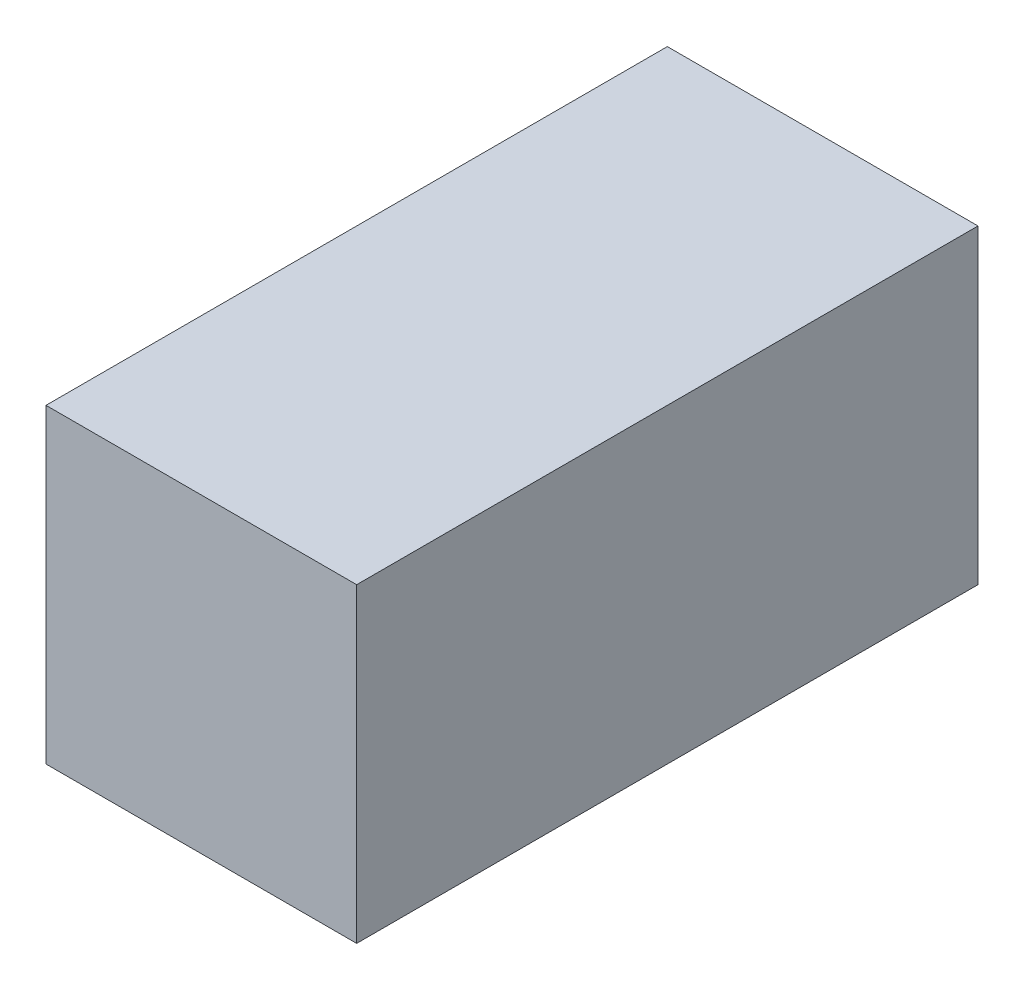
ISO-10303-21;
HEADER;
FILE_DESCRIPTION(('STEP AP214'),'2;1');
FILE_NAME('part.step','',(''),(''),'','','');
FILE_SCHEMA(('AUTOMOTIVE_DESIGN { 1 0 10303 214 1 1 1 1 }'));
ENDSEC;
DATA;
#1=APPLICATION_CONTEXT('core data for automotive mechanical design processes');
#2=APPLICATION_PROTOCOL_DEFINITION('international standard','automotive_design',2000,#1);
#3=PRODUCT_CONTEXT('',#1,'mechanical');
#4=PRODUCT('Part','Part','',(#3));
#5=PRODUCT_RELATED_PRODUCT_CATEGORY('part','',(#4));
#6=PRODUCT_DEFINITION_FORMATION('','',#4);
#7=PRODUCT_DEFINITION_CONTEXT('part definition',#1,'design');
#8=PRODUCT_DEFINITION('design','',#6,#7);
#9=PRODUCT_DEFINITION_SHAPE('','',#8);
#10=(LENGTH_UNIT() NAMED_UNIT(*) SI_UNIT(.MILLI.,.METRE.));
#11=(NAMED_UNIT(*) PLANE_ANGLE_UNIT() SI_UNIT($,.RADIAN.));
#12=(NAMED_UNIT(*) SI_UNIT($,.STERADIAN.) SOLID_ANGLE_UNIT());
#13=UNCERTAINTY_MEASURE_WITH_UNIT(LENGTH_MEASURE(1.E-05),#10,'distance_accuracy_value','');
#14=(GEOMETRIC_REPRESENTATION_CONTEXT(3) GLOBAL_UNCERTAINTY_ASSIGNED_CONTEXT((#13)) GLOBAL_UNIT_ASSIGNED_CONTEXT((#10,
#11,#12)) REPRESENTATION_CONTEXT('',''));
#15=CARTESIAN_POINT('',(0.,0.,0.));
#16=DIRECTION('',(0.,0.,1.));
#17=DIRECTION('',(1.,0.,0.));
#18=AXIS2_PLACEMENT_3D('',#15,#16,#17);
#19=CARTESIAN_POINT('',(5.,10.,-10.));
#20=DIRECTION('',(-1.,0.,0.));
#21=DIRECTION('',(0.,0.,1.));
#22=AXIS2_PLACEMENT_3D('',#19,#20,#21);
#23=PLANE('',#22);
#24=DIRECTION('',(0.,0.,-1.));
#25=VECTOR('',#24,1.);
#26=CARTESIAN_POINT('',(5.,0.,-10.));
#27=LINE('',#26,#25);
#28=CARTESIAN_POINT('',(5.,0.,10.));
#29=VERTEX_POINT('',#28);
#30=CARTESIAN_POINT('',(5.,0.,-10.));
#31=VERTEX_POINT('',#30);
#32=EDGE_CURVE('E113',#29,#31,#27,.T.);
#33=ORIENTED_EDGE('',*,*,#32,.T.);
#34=DIRECTION('',(0.,-1.,0.));
#35=VECTOR('',#34,1.);
#36=CARTESIAN_POINT('',(5.,10.,-10.));
#37=LINE('',#36,#35);
#38=CARTESIAN_POINT('',(5.,10.,-10.));
#39=VERTEX_POINT('',#38);
#40=EDGE_CURVE('E11',#39,#31,#37,.T.);
#41=ORIENTED_EDGE('',*,*,#40,.F.);
#42=DIRECTION('',(0.,0.,-1.));
#43=VECTOR('',#42,1.);
#44=CARTESIAN_POINT('',(5.,10.,-10.));
#45=LINE('',#44,#43);
#46=CARTESIAN_POINT('',(5.,10.,10.));
#47=VERTEX_POINT('',#46);
#48=EDGE_CURVE('E97',#47,#39,#45,.T.);
#49=ORIENTED_EDGE('',*,*,#48,.F.);
#50=DIRECTION('',(0.,-1.,0.));
#51=VECTOR('',#50,1.);
#52=CARTESIAN_POINT('',(5.,10.,10.));
#53=LINE('',#52,#51);
#54=EDGE_CURVE('E109',#47,#29,#53,.T.);
#55=ORIENTED_EDGE('',*,*,#54,.T.);
#56=EDGE_LOOP('',(#33,#41,#49,#55));
#57=FACE_BOUND('',#56,.T.);
#58=ADVANCED_FACE('F45',(#57),#23,.F.);
#59=CARTESIAN_POINT('',(-5.,10.,-10.));
#60=DIRECTION('',(0.,0.,1.));
#61=DIRECTION('',(1.,0.,0.));
#62=AXIS2_PLACEMENT_3D('',#59,#60,#61);
#63=PLANE('',#62);
#64=CARTESIAN_POINT('',(0.,5.,-10.));
#65=DIRECTION('',(0.,0.,-1.));
#66=DIRECTION('',(-1.,0.,0.));
#67=AXIS2_PLACEMENT_3D('',#64,#65,#66);
#68=CIRCLE('',#67,2.5);
#69=CARTESIAN_POINT('',(-2.5,5.,-10.));
#70=VERTEX_POINT('',#69);
#71=EDGE_CURVE('E134',#70,#70,#68,.T.);
#72=ORIENTED_EDGE('',*,*,#71,.F.);
#73=EDGE_LOOP('',(#72));
#74=FACE_BOUND('',#73,.T.);
#75=DIRECTION('',(-1.,0.,0.));
#76=VECTOR('',#75,1.);
#77=CARTESIAN_POINT('',(-5.,0.,-10.));
#78=LINE('',#77,#76);
#79=CARTESIAN_POINT('',(-5.,0.,-10.));
#80=VERTEX_POINT('',#79);
#81=EDGE_CURVE('E102',#31,#80,#78,.T.);
#82=ORIENTED_EDGE('',*,*,#81,.T.);
#83=DIRECTION('',(0.,-1.,0.));
#84=VECTOR('',#83,1.);
#85=CARTESIAN_POINT('',(-5.,10.,-10.));
#86=LINE('',#85,#84);
#87=CARTESIAN_POINT('',(-5.,10.,-10.));
#88=VERTEX_POINT('',#87);
#89=EDGE_CURVE('E54',#88,#80,#86,.T.);
#90=ORIENTED_EDGE('',*,*,#89,.F.);
#91=DIRECTION('',(-1.,0.,0.));
#92=VECTOR('',#91,1.);
#93=CARTESIAN_POINT('',(-5.,10.,-10.));
#94=LINE('',#93,#92);
#95=EDGE_CURVE('E92',#39,#88,#94,.T.);
#96=ORIENTED_EDGE('',*,*,#95,.F.);
#97=ORIENTED_EDGE('',*,*,#40,.T.);
#98=EDGE_LOOP('',(#82,#90,#96,#97));
#99=FACE_BOUND('',#98,.T.);
#100=ADVANCED_FACE('F101',(#74,#99),#63,.F.);
#101=CARTESIAN_POINT('',(-5.,10.,-10.));
#102=DIRECTION('',(1.,0.,0.));
#103=DIRECTION('',(0.,0.,-1.));
#104=AXIS2_PLACEMENT_3D('',#101,#102,#103);
#105=PLANE('',#104);
#106=DIRECTION('',(0.,0.,1.));
#107=VECTOR('',#106,1.);
#108=CARTESIAN_POINT('',(-5.,0.,-10.));
#109=LINE('',#108,#107);
#110=CARTESIAN_POINT('',(-5.,0.,10.));
#111=VERTEX_POINT('',#110);
#112=EDGE_CURVE('E79',#80,#111,#109,.T.);
#113=ORIENTED_EDGE('',*,*,#112,.T.);
#114=DIRECTION('',(0.,-1.,0.));
#115=VECTOR('',#114,1.);
#116=CARTESIAN_POINT('',(-5.,10.,10.));
#117=LINE('',#116,#115);
#118=CARTESIAN_POINT('',(-5.,10.,10.));
#119=VERTEX_POINT('',#118);
#120=EDGE_CURVE('E104',#119,#111,#117,.T.);
#121=ORIENTED_EDGE('',*,*,#120,.F.);
#122=DIRECTION('',(0.,0.,1.));
#123=VECTOR('',#122,1.);
#124=CARTESIAN_POINT('',(-5.,10.,-10.));
#125=LINE('',#124,#123);
#126=EDGE_CURVE('E95',#88,#119,#125,.T.);
#127=ORIENTED_EDGE('',*,*,#126,.F.);
#128=ORIENTED_EDGE('',*,*,#89,.T.);
#129=EDGE_LOOP('',(#113,#121,#127,#128));
#130=FACE_BOUND('',#129,.T.);
#131=ADVANCED_FACE('F105',(#130),#105,.F.);
#132=CARTESIAN_POINT('',(-5.,10.,10.));
#133=DIRECTION('',(0.,0.,-1.));
#134=DIRECTION('',(-1.,0.,0.));
#135=AXIS2_PLACEMENT_3D('',#132,#133,#134);
#136=PLANE('',#135);
#137=DIRECTION('',(1.,0.,0.));
#138=VECTOR('',#137,1.);
#139=CARTESIAN_POINT('',(-5.,0.,10.));
#140=LINE('',#139,#138);
#141=EDGE_CURVE('E85',#111,#29,#140,.T.);
#142=ORIENTED_EDGE('',*,*,#141,.T.);
#143=ORIENTED_EDGE('',*,*,#54,.F.);
#144=DIRECTION('',(1.,0.,0.));
#145=VECTOR('',#144,1.);
#146=CARTESIAN_POINT('',(-5.,10.,10.));
#147=LINE('',#146,#145);
#148=EDGE_CURVE('E62',#119,#47,#147,.T.);
#149=ORIENTED_EDGE('',*,*,#148,.F.);
#150=ORIENTED_EDGE('',*,*,#120,.T.);
#151=EDGE_LOOP('',(#142,#143,#149,#150));
#152=FACE_BOUND('',#151,.T.);
#153=ADVANCED_FACE('F127',(#152),#136,.F.);
#154=CARTESIAN_POINT('',(0.,10.,0.));
#155=DIRECTION('',(0.,1.,0.));
#156=DIRECTION('',(0.,0.,1.));
#157=AXIS2_PLACEMENT_3D('',#154,#155,#156);
#158=PLANE('',#157);
#159=ORIENTED_EDGE('',*,*,#48,.T.);
#160=ORIENTED_EDGE('',*,*,#95,.T.);
#161=ORIENTED_EDGE('',*,*,#126,.T.);
#162=ORIENTED_EDGE('',*,*,#148,.T.);
#163=EDGE_LOOP('',(#159,#160,#161,#162));
#164=FACE_BOUND('',#163,.T.);
#165=ADVANCED_FACE('F93',(#164),#158,.T.);
#166=CARTESIAN_POINT('',(0.,0.,0.));
#167=DIRECTION('',(0.,1.,0.));
#168=DIRECTION('',(0.,0.,1.));
#169=AXIS2_PLACEMENT_3D('',#166,#167,#168);
#170=PLANE('',#169);
#171=ORIENTED_EDGE('',*,*,#32,.F.);
#172=ORIENTED_EDGE('',*,*,#141,.F.);
#173=ORIENTED_EDGE('',*,*,#112,.F.);
#174=ORIENTED_EDGE('',*,*,#81,.F.);
#175=EDGE_LOOP('',(#171,#172,#173,#174));
#176=FACE_BOUND('',#175,.T.);
#177=ADVANCED_FACE('F130',(#176),#170,.F.);
#178=CARTESIAN_POINT('',(0.,5.,-6.));
#179=DIRECTION('',(0.,0.,-1.));
#180=DIRECTION('',(-1.,0.,0.));
#181=AXIS2_PLACEMENT_3D('',#178,#179,#180);
#182=CYLINDRICAL_SURFACE('',#181,2.5);
#183=CARTESIAN_POINT('',(0.,5.,-6.));
#184=DIRECTION('',(0.,0.,-1.));
#185=DIRECTION('',(-1.,0.,0.));
#186=AXIS2_PLACEMENT_3D('',#183,#184,#185);
#187=CIRCLE('',#186,2.5);
#188=CARTESIAN_POINT('',(-2.5,5.,-6.));
#189=VERTEX_POINT('',#188);
#190=EDGE_CURVE('E117',#189,#189,#187,.T.);
#191=ORIENTED_EDGE('',*,*,#190,.F.);
#192=EDGE_LOOP('',(#191));
#193=FACE_BOUND('',#192,.T.);
#194=ORIENTED_EDGE('',*,*,#71,.T.);
#195=EDGE_LOOP('',(#194));
#196=FACE_BOUND('',#195,.T.);
#197=ADVANCED_FACE('F144',(#193,#196),#182,.F.);
#198=CARTESIAN_POINT('',(0.,5.,-6.));
#199=DIRECTION('',(0.,0.,-1.));
#200=DIRECTION('',(-1.,0.,0.));
#201=AXIS2_PLACEMENT_3D('',#198,#199,#200);
#202=PLANE('',#201);
#203=ORIENTED_EDGE('',*,*,#190,.T.);
#204=EDGE_LOOP('',(#203));
#205=FACE_BOUND('',#204,.T.);
#206=ADVANCED_FACE('F142',(#205),#202,.T.);
#207=CLOSED_SHELL('',(#58,#100,#131,#153,#165,#177,#197,#206));
#208=MANIFOLD_SOLID_BREP('B2',#207);
#209=ADVANCED_BREP_SHAPE_REPRESENTATION('',(#18,#208),#14);
#210=SHAPE_DEFINITION_REPRESENTATION(#9,#209);
ENDSEC;
END-ISO-10303-21;
